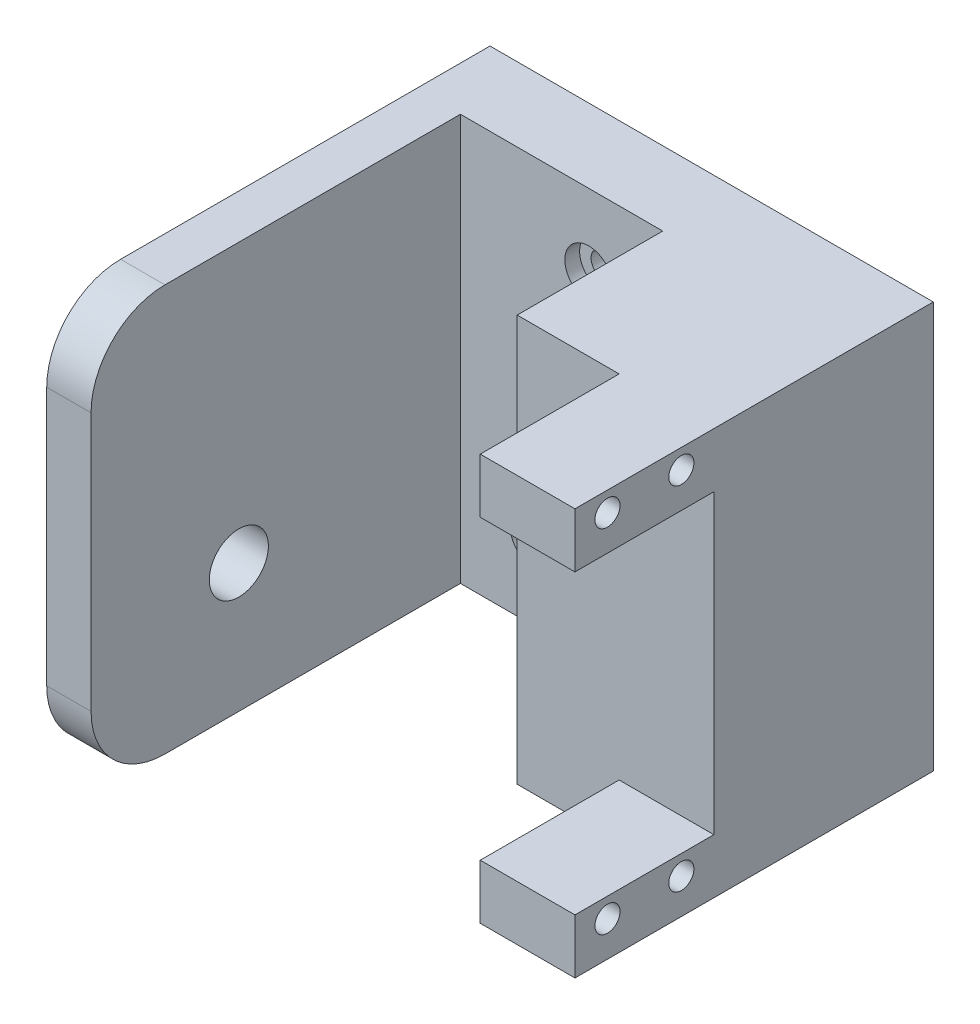
ISO-10303-21;
HEADER;
FILE_DESCRIPTION(('STEP AP214'),'2;1');
FILE_NAME('part.step','',(''),(''),'','','');
FILE_SCHEMA(('AUTOMOTIVE_DESIGN { 1 0 10303 214 1 1 1 1 }'));
ENDSEC;
DATA;
#1=APPLICATION_CONTEXT('core data for automotive mechanical design processes');
#2=APPLICATION_PROTOCOL_DEFINITION('international standard','automotive_design',2000,#1);
#3=PRODUCT_CONTEXT('',#1,'mechanical');
#4=PRODUCT('Part','Part','',(#3));
#5=PRODUCT_RELATED_PRODUCT_CATEGORY('part','',(#4));
#6=PRODUCT_DEFINITION_FORMATION('','',#4);
#7=PRODUCT_DEFINITION_CONTEXT('part definition',#1,'design');
#8=PRODUCT_DEFINITION('design','',#6,#7);
#9=PRODUCT_DEFINITION_SHAPE('','',#8);
#10=(LENGTH_UNIT() NAMED_UNIT(*) SI_UNIT(.MILLI.,.METRE.));
#11=(NAMED_UNIT(*) PLANE_ANGLE_UNIT() SI_UNIT($,.RADIAN.));
#12=(NAMED_UNIT(*) SI_UNIT($,.STERADIAN.) SOLID_ANGLE_UNIT());
#13=UNCERTAINTY_MEASURE_WITH_UNIT(LENGTH_MEASURE(1.E-05),#10,'distance_accuracy_value','');
#14=(GEOMETRIC_REPRESENTATION_CONTEXT(3) GLOBAL_UNCERTAINTY_ASSIGNED_CONTEXT((#13)) GLOBAL_UNIT_ASSIGNED_CONTEXT((#10,
#11,#12)) REPRESENTATION_CONTEXT('',''));
#15=CARTESIAN_POINT('',(0.,0.,0.));
#16=DIRECTION('',(0.,0.,1.));
#17=DIRECTION('',(1.,0.,0.));
#18=AXIS2_PLACEMENT_3D('',#15,#16,#17);
#19=CARTESIAN_POINT('',(60.,0.,10.));
#20=DIRECTION('',(-1.,0.,0.));
#21=DIRECTION('',(0.,0.,1.));
#22=AXIS2_PLACEMENT_3D('',#19,#20,#21);
#23=PLANE('',#22);
#24=CARTESIAN_POINT('',(60.,52.35,34.1));
#25=DIRECTION('',(-1.,0.,0.));
#26=DIRECTION('',(0.,0.,1.));
#27=AXIS2_PLACEMENT_3D('',#24,#25,#26);
#28=CIRCLE('',#27,1.69999999999999);
#29=CARTESIAN_POINT('',(60.,52.35,35.8));
#30=VERTEX_POINT('',#29);
#31=EDGE_CURVE('E356',#30,#30,#28,.F.);
#32=ORIENTED_EDGE('',*,*,#31,.F.);
#33=EDGE_LOOP('',(#32));
#34=FACE_BOUND('',#33,.T.);
#35=CARTESIAN_POINT('',(60.,4.75,34.1));
#36=DIRECTION('',(-1.,0.,0.));
#37=DIRECTION('',(0.,0.,1.));
#38=AXIS2_PLACEMENT_3D('',#35,#36,#37);
#39=CIRCLE('',#38,1.69999999999999);
#40=CARTESIAN_POINT('',(60.,4.75,35.8));
#41=VERTEX_POINT('',#40);
#42=EDGE_CURVE('E341',#41,#41,#39,.F.);
#43=ORIENTED_EDGE('',*,*,#42,.F.);
#44=EDGE_LOOP('',(#43));
#45=FACE_BOUND('',#44,.T.);
#46=DIRECTION('',(0.,1.,0.));
#47=VECTOR('',#46,1.);
#48=CARTESIAN_POINT('',(60.,0.,0.));
#49=LINE('',#48,#47);
#50=CARTESIAN_POINT('',(60.,0.,0.));
#51=VERTEX_POINT('',#50);
#52=CARTESIAN_POINT('',(60.,55.,0.));
#53=VERTEX_POINT('',#52);
#54=EDGE_CURVE('E272',#51,#53,#49,.T.);
#55=ORIENTED_EDGE('',*,*,#54,.T.);
#56=DIRECTION('',(0.,0.,-1.));
#57=VECTOR('',#56,1.);
#58=CARTESIAN_POINT('',(60.,55.,10.));
#59=LINE('',#58,#57);
#60=CARTESIAN_POINT('',(60.,55.,48.5));
#61=VERTEX_POINT('',#60);
#62=EDGE_CURVE('E277',#61,#53,#59,.T.);
#63=ORIENTED_EDGE('',*,*,#62,.F.);
#64=DIRECTION('',(0.,1.,0.));
#65=VECTOR('',#64,1.);
#66=CARTESIAN_POINT('',(60.,55.,48.5));
#67=LINE('',#66,#65);
#68=CARTESIAN_POINT('',(60.,47.6,48.5));
#69=VERTEX_POINT('',#68);
#70=EDGE_CURVE('E159',#69,#61,#67,.T.);
#71=ORIENTED_EDGE('',*,*,#70,.F.);
#72=DIRECTION('',(0.,0.,-1.));
#73=VECTOR('',#72,1.);
#74=CARTESIAN_POINT('',(60.,47.6,48.5));
#75=LINE('',#74,#73);
#76=CARTESIAN_POINT('',(60.,47.6,29.7));
#77=VERTEX_POINT('',#76);
#78=EDGE_CURVE('E155',#69,#77,#75,.T.);
#79=ORIENTED_EDGE('',*,*,#78,.T.);
#80=DIRECTION('',(0.,1.,0.));
#81=VECTOR('',#80,1.);
#82=CARTESIAN_POINT('',(60.,55.,29.7));
#83=LINE('',#82,#81);
#84=CARTESIAN_POINT('',(60.,7.4,29.7));
#85=VERTEX_POINT('',#84);
#86=EDGE_CURVE('E57',#85,#77,#83,.T.);
#87=ORIENTED_EDGE('',*,*,#86,.F.);
#88=DIRECTION('',(0.,0.,-1.));
#89=VECTOR('',#88,1.);
#90=CARTESIAN_POINT('',(60.,7.4,48.5));
#91=LINE('',#90,#89);
#92=CARTESIAN_POINT('',(60.,7.4,48.5));
#93=VERTEX_POINT('',#92);
#94=EDGE_CURVE('E195',#93,#85,#91,.T.);
#95=ORIENTED_EDGE('',*,*,#94,.F.);
#96=DIRECTION('',(0.,1.,0.));
#97=VECTOR('',#96,1.);
#98=CARTESIAN_POINT('',(60.,7.4,48.5));
#99=LINE('',#98,#97);
#100=CARTESIAN_POINT('',(60.,0.,48.5));
#101=VERTEX_POINT('',#100);
#102=EDGE_CURVE('E187',#101,#93,#99,.T.);
#103=ORIENTED_EDGE('',*,*,#102,.F.);
#104=DIRECTION('',(0.,0.,-1.));
#105=VECTOR('',#104,1.);
#106=CARTESIAN_POINT('',(60.,0.,10.));
#107=LINE('',#106,#105);
#108=EDGE_CURVE('E280',#101,#51,#107,.T.);
#109=ORIENTED_EDGE('',*,*,#108,.T.);
#110=EDGE_LOOP('',(#55,#63,#71,#79,#87,#95,#103,#109));
#111=FACE_BOUND('',#110,.T.);
#112=CARTESIAN_POINT('',(60.,4.75,44.1));
#113=DIRECTION('',(-1.,0.,0.));
#114=DIRECTION('',(0.,0.,1.));
#115=AXIS2_PLACEMENT_3D('',#112,#113,#114);
#116=CIRCLE('',#115,1.69999999999999);
#117=CARTESIAN_POINT('',(60.,4.75,45.8));
#118=VERTEX_POINT('',#117);
#119=EDGE_CURVE('E350',#118,#118,#116,.F.);
#120=ORIENTED_EDGE('',*,*,#119,.F.);
#121=EDGE_LOOP('',(#120));
#122=FACE_BOUND('',#121,.T.);
#123=CARTESIAN_POINT('',(60.,52.35,44.1));
#124=DIRECTION('',(-1.,0.,0.));
#125=DIRECTION('',(0.,0.,1.));
#126=AXIS2_PLACEMENT_3D('',#123,#124,#125);
#127=CIRCLE('',#126,1.69999999999999);
#128=CARTESIAN_POINT('',(60.,52.35,45.8));
#129=VERTEX_POINT('',#128);
#130=EDGE_CURVE('E362',#129,#129,#127,.F.);
#131=ORIENTED_EDGE('',*,*,#130,.F.);
#132=EDGE_LOOP('',(#131));
#133=FACE_BOUND('',#132,.T.);
#134=ADVANCED_FACE('F37',(#34,#45,#111,#122,#133),#23,.F.);
#135=CARTESIAN_POINT('',(0.,0.,29.7));
#136=DIRECTION('',(0.,0.,1.));
#137=DIRECTION('',(1.,0.,0.));
#138=AXIS2_PLACEMENT_3D('',#135,#136,#137);
#139=PLANE('',#138);
#140=DIRECTION('',(1.,0.,0.));
#141=VECTOR('',#140,1.);
#142=CARTESIAN_POINT('',(47.18,47.6,29.7));
#143=LINE('',#142,#141);
#144=CARTESIAN_POINT('',(47.18,47.6,29.7));
#145=VERTEX_POINT('',#144);
#146=EDGE_CURVE('E52',#145,#77,#143,.T.);
#147=ORIENTED_EDGE('',*,*,#146,.F.);
#148=DIRECTION('',(0.,-1.,0.));
#149=VECTOR('',#148,1.);
#150=CARTESIAN_POINT('',(47.18,55.,29.7));
#151=LINE('',#150,#149);
#152=CARTESIAN_POINT('',(47.18,55.,29.7));
#153=VERTEX_POINT('',#152);
#154=EDGE_CURVE('E171',#153,#145,#151,.T.);
#155=ORIENTED_EDGE('',*,*,#154,.F.);
#156=DIRECTION('',(-1.,0.,0.));
#157=VECTOR('',#156,1.);
#158=CARTESIAN_POINT('',(33.38,55.,29.7));
#159=LINE('',#158,#157);
#160=CARTESIAN_POINT('',(33.38,55.,29.7));
#161=VERTEX_POINT('',#160);
#162=EDGE_CURVE('E237',#153,#161,#159,.T.);
#163=ORIENTED_EDGE('',*,*,#162,.T.);
#164=DIRECTION('',(0.,-1.,0.));
#165=VECTOR('',#164,1.);
#166=CARTESIAN_POINT('',(33.38,55.,29.7));
#167=LINE('',#166,#165);
#168=CARTESIAN_POINT('',(33.38,0.,29.7));
#169=VERTEX_POINT('',#168);
#170=EDGE_CURVE('E230',#161,#169,#167,.T.);
#171=ORIENTED_EDGE('',*,*,#170,.T.);
#172=DIRECTION('',(1.,0.,0.));
#173=VECTOR('',#172,1.);
#174=CARTESIAN_POINT('',(33.38,0.,29.7));
#175=LINE('',#174,#173);
#176=CARTESIAN_POINT('',(47.18,0.,29.7));
#177=VERTEX_POINT('',#176);
#178=EDGE_CURVE('E233',#169,#177,#175,.T.);
#179=ORIENTED_EDGE('',*,*,#178,.T.);
#180=DIRECTION('',(0.,-1.,0.));
#181=VECTOR('',#180,1.);
#182=CARTESIAN_POINT('',(47.18,7.4,29.7));
#183=LINE('',#182,#181);
#184=CARTESIAN_POINT('',(47.18,7.4,29.7));
#185=VERTEX_POINT('',#184);
#186=EDGE_CURVE('E172',#185,#177,#183,.T.);
#187=ORIENTED_EDGE('',*,*,#186,.F.);
#188=DIRECTION('',(-1.,0.,0.));
#189=VECTOR('',#188,1.);
#190=CARTESIAN_POINT('',(47.18,7.4,29.7));
#191=LINE('',#190,#189);
#192=EDGE_CURVE('E175',#85,#185,#191,.T.);
#193=ORIENTED_EDGE('',*,*,#192,.F.);
#194=ORIENTED_EDGE('',*,*,#86,.T.);
#195=EDGE_LOOP('',(#147,#155,#163,#171,#179,#187,#193,#194));
#196=FACE_BOUND('',#195,.T.);
#197=ADVANCED_FACE('F339',(#196),#139,.T.);
#198=CARTESIAN_POINT('',(0.,0.,10.));
#199=DIRECTION('',(0.,0.,-1.));
#200=DIRECTION('',(-1.,0.,0.));
#201=AXIS2_PLACEMENT_3D('',#198,#199,#200);
#202=PLANE('',#201);
#203=CARTESIAN_POINT('',(23.38,45.,10.));
#204=DIRECTION('',(0.,0.,1.));
#205=DIRECTION('',(1.,0.,0.));
#206=AXIS2_PLACEMENT_3D('',#203,#204,#205);
#207=CIRCLE('',#206,3.25);
#208=CARTESIAN_POINT('',(26.63,45.,10.));
#209=VERTEX_POINT('',#208);
#210=EDGE_CURVE('E205',#209,#209,#207,.T.);
#211=ORIENTED_EDGE('',*,*,#210,.F.);
#212=EDGE_LOOP('',(#211));
#213=FACE_BOUND('',#212,.T.);
#214=CARTESIAN_POINT('',(16.,10.,10.));
#215=DIRECTION('',(0.,0.,1.));
#216=DIRECTION('',(1.,0.,0.));
#217=AXIS2_PLACEMENT_3D('',#214,#215,#216);
#218=CIRCLE('',#217,3.25);
#219=CARTESIAN_POINT('',(19.25,10.,10.));
#220=VERTEX_POINT('',#219);
#221=EDGE_CURVE('E213',#220,#220,#218,.T.);
#222=ORIENTED_EDGE('',*,*,#221,.F.);
#223=EDGE_LOOP('',(#222));
#224=FACE_BOUND('',#223,.T.);
#225=DIRECTION('',(0.,-1.,0.));
#226=VECTOR('',#225,1.);
#227=CARTESIAN_POINT('',(33.38,55.,10.));
#228=LINE('',#227,#226);
#229=CARTESIAN_POINT('',(33.38,55.,10.));
#230=VERTEX_POINT('',#229);
#231=CARTESIAN_POINT('',(33.38,0.,10.));
#232=VERTEX_POINT('',#231);
#233=EDGE_CURVE('E225',#230,#232,#228,.T.);
#234=ORIENTED_EDGE('',*,*,#233,.F.);
#235=DIRECTION('',(-1.,0.,0.));
#236=VECTOR('',#235,1.);
#237=CARTESIAN_POINT('',(0.,55.,10.));
#238=LINE('',#237,#236);
#239=CARTESIAN_POINT('',(6.,55.,10.));
#240=VERTEX_POINT('',#239);
#241=EDGE_CURVE('E263',#230,#240,#238,.T.);
#242=ORIENTED_EDGE('',*,*,#241,.T.);
#243=DIRECTION('',(0.,1.,0.));
#244=VECTOR('',#243,1.);
#245=CARTESIAN_POINT('',(6.,55.,10.));
#246=LINE('',#245,#244);
#247=CARTESIAN_POINT('',(6.,0.,10.));
#248=VERTEX_POINT('',#247);
#249=EDGE_CURVE('E247',#248,#240,#246,.T.);
#250=ORIENTED_EDGE('',*,*,#249,.F.);
#251=DIRECTION('',(1.,0.,0.));
#252=VECTOR('',#251,1.);
#253=CARTESIAN_POINT('',(0.,0.,10.));
#254=LINE('',#253,#252);
#255=EDGE_CURVE('E261',#248,#232,#254,.T.);
#256=ORIENTED_EDGE('',*,*,#255,.T.);
#257=EDGE_LOOP('',(#234,#242,#250,#256));
#258=FACE_BOUND('',#257,.T.);
#259=ADVANCED_FACE('F334',(#213,#224,#258),#202,.F.);
#260=CARTESIAN_POINT('',(0.,0.,10.));
#261=DIRECTION('',(1.,0.,0.));
#262=DIRECTION('',(0.,0.,-1.));
#263=AXIS2_PLACEMENT_3D('',#260,#261,#262);
#264=PLANE('',#263);
#265=CARTESIAN_POINT('',(0.,17.4,40.));
#266=DIRECTION('',(-1.,0.,0.));
#267=DIRECTION('',(0.,0.,1.));
#268=AXIS2_PLACEMENT_3D('',#265,#266,#267);
#269=CIRCLE('',#268,4.00000000000001);
#270=CARTESIAN_POINT('',(0.,17.4,44.));
#271=VERTEX_POINT('',#270);
#272=EDGE_CURVE('E199',#271,#271,#269,.T.);
#273=ORIENTED_EDGE('',*,*,#272,.F.);
#274=EDGE_LOOP('',(#273));
#275=FACE_BOUND('',#274,.T.);
#276=DIRECTION('',(0.,-1.,0.));
#277=VECTOR('',#276,1.);
#278=CARTESIAN_POINT('',(0.,55.,60.));
#279=LINE('',#278,#277);
#280=CARTESIAN_POINT('',(0.,45.,60.));
#281=VERTEX_POINT('',#280);
#282=CARTESIAN_POINT('',(0.,10.,60.));
#283=VERTEX_POINT('',#282);
#284=EDGE_CURVE('E248',#281,#283,#279,.T.);
#285=ORIENTED_EDGE('',*,*,#284,.F.);
#286=CARTESIAN_POINT('',(0.,45.,50.));
#287=DIRECTION('',(1.,0.,0.));
#288=DIRECTION('',(0.,0.,-1.));
#289=AXIS2_PLACEMENT_3D('',#286,#287,#288);
#290=CIRCLE('',#289,10.);
#291=CARTESIAN_POINT('',(0.,55.,50.));
#292=VERTEX_POINT('',#291);
#293=EDGE_CURVE('E293',#281,#292,#290,.F.);
#294=ORIENTED_EDGE('',*,*,#293,.T.);
#295=DIRECTION('',(0.,0.,-1.));
#296=VECTOR('',#295,1.);
#297=CARTESIAN_POINT('',(0.,55.,10.));
#298=LINE('',#297,#296);
#299=CARTESIAN_POINT('',(0.,55.,0.));
#300=VERTEX_POINT('',#299);
#301=EDGE_CURVE('E267',#292,#300,#298,.T.);
#302=ORIENTED_EDGE('',*,*,#301,.T.);
#303=DIRECTION('',(0.,-1.,0.));
#304=VECTOR('',#303,1.);
#305=CARTESIAN_POINT('',(0.,0.,0.));
#306=LINE('',#305,#304);
#307=CARTESIAN_POINT('',(0.,0.,0.));
#308=VERTEX_POINT('',#307);
#309=EDGE_CURVE('E260',#300,#308,#306,.T.);
#310=ORIENTED_EDGE('',*,*,#309,.T.);
#311=DIRECTION('',(0.,0.,-1.));
#312=VECTOR('',#311,1.);
#313=CARTESIAN_POINT('',(0.,0.,10.));
#314=LINE('',#313,#312);
#315=CARTESIAN_POINT('',(0.,0.,50.));
#316=VERTEX_POINT('',#315);
#317=EDGE_CURVE('E283',#316,#308,#314,.T.);
#318=ORIENTED_EDGE('',*,*,#317,.F.);
#319=CARTESIAN_POINT('',(0.,10.,50.));
#320=DIRECTION('',(1.,0.,0.));
#321=DIRECTION('',(0.,0.,-1.));
#322=AXIS2_PLACEMENT_3D('',#319,#320,#321);
#323=CIRCLE('',#322,10.);
#324=EDGE_CURVE('E291',#316,#283,#323,.F.);
#325=ORIENTED_EDGE('',*,*,#324,.T.);
#326=EDGE_LOOP('',(#285,#294,#302,#310,#318,#325));
#327=FACE_BOUND('',#326,.T.);
#328=ADVANCED_FACE('F313',(#275,#327),#264,.F.);
#329=CARTESIAN_POINT('',(0.,0.,10.));
#330=DIRECTION('',(0.,1.,0.));
#331=DIRECTION('',(0.,0.,1.));
#332=AXIS2_PLACEMENT_3D('',#329,#330,#331);
#333=PLANE('',#332);
#334=DIRECTION('',(0.,0.,-1.));
#335=VECTOR('',#334,1.);
#336=CARTESIAN_POINT('',(6.,0.,60.));
#337=LINE('',#336,#335);
#338=CARTESIAN_POINT('',(6.,0.,50.));
#339=VERTEX_POINT('',#338);
#340=EDGE_CURVE('E258',#339,#248,#337,.T.);
#341=ORIENTED_EDGE('',*,*,#340,.F.);
#342=DIRECTION('',(1.,0.,0.));
#343=VECTOR('',#342,1.);
#344=CARTESIAN_POINT('',(0.,0.,50.));
#345=LINE('',#344,#343);
#346=EDGE_CURVE('E11',#339,#316,#345,.F.);
#347=ORIENTED_EDGE('',*,*,#346,.T.);
#348=ORIENTED_EDGE('',*,*,#317,.T.);
#349=DIRECTION('',(1.,0.,0.));
#350=VECTOR('',#349,1.);
#351=CARTESIAN_POINT('',(0.,0.,0.));
#352=LINE('',#351,#350);
#353=EDGE_CURVE('E270',#308,#51,#352,.T.);
#354=ORIENTED_EDGE('',*,*,#353,.T.);
#355=ORIENTED_EDGE('',*,*,#108,.F.);
#356=DIRECTION('',(1.,0.,0.));
#357=VECTOR('',#356,1.);
#358=CARTESIAN_POINT('',(47.18,0.,48.5));
#359=LINE('',#358,#357);
#360=CARTESIAN_POINT('',(47.18,0.,48.5));
#361=VERTEX_POINT('',#360);
#362=EDGE_CURVE('E184',#361,#101,#359,.T.);
#363=ORIENTED_EDGE('',*,*,#362,.F.);
#364=DIRECTION('',(0.,0.,-1.));
#365=VECTOR('',#364,1.);
#366=CARTESIAN_POINT('',(47.18,0.,48.5));
#367=LINE('',#366,#365);
#368=EDGE_CURVE('E197',#361,#177,#367,.T.);
#369=ORIENTED_EDGE('',*,*,#368,.T.);
#370=ORIENTED_EDGE('',*,*,#178,.F.);
#371=DIRECTION('',(0.,0.,-1.));
#372=VECTOR('',#371,1.);
#373=CARTESIAN_POINT('',(33.38,0.,29.7));
#374=LINE('',#373,#372);
#375=EDGE_CURVE('E244',#169,#232,#374,.T.);
#376=ORIENTED_EDGE('',*,*,#375,.T.);
#377=ORIENTED_EDGE('',*,*,#255,.F.);
#378=EDGE_LOOP('',(#341,#347,#348,#354,#355,#363,#369,#370,#376,#377));
#379=FACE_BOUND('',#378,.T.);
#380=ADVANCED_FACE('F330',(#379),#333,.F.);
#381=CARTESIAN_POINT('',(0.,55.,10.));
#382=DIRECTION('',(0.,-1.,0.));
#383=DIRECTION('',(0.,0.,-1.));
#384=AXIS2_PLACEMENT_3D('',#381,#382,#383);
#385=PLANE('',#384);
#386=ORIENTED_EDGE('',*,*,#301,.F.);
#387=DIRECTION('',(-1.,0.,0.));
#388=VECTOR('',#387,1.);
#389=CARTESIAN_POINT('',(6.,55.,50.));
#390=LINE('',#389,#388);
#391=CARTESIAN_POINT('',(6.,55.,50.));
#392=VERTEX_POINT('',#391);
#393=EDGE_CURVE('E295',#292,#392,#390,.F.);
#394=ORIENTED_EDGE('',*,*,#393,.T.);
#395=DIRECTION('',(0.,0.,-1.));
#396=VECTOR('',#395,1.);
#397=CARTESIAN_POINT('',(6.,55.,60.));
#398=LINE('',#397,#396);
#399=EDGE_CURVE('E254',#392,#240,#398,.T.);
#400=ORIENTED_EDGE('',*,*,#399,.T.);
#401=ORIENTED_EDGE('',*,*,#241,.F.);
#402=DIRECTION('',(0.,0.,-1.));
#403=VECTOR('',#402,1.);
#404=CARTESIAN_POINT('',(33.38,55.,29.7));
#405=LINE('',#404,#403);
#406=EDGE_CURVE('E239',#161,#230,#405,.T.);
#407=ORIENTED_EDGE('',*,*,#406,.F.);
#408=ORIENTED_EDGE('',*,*,#162,.F.);
#409=DIRECTION('',(0.,0.,-1.));
#410=VECTOR('',#409,1.);
#411=CARTESIAN_POINT('',(47.18,55.,48.5));
#412=LINE('',#411,#410);
#413=CARTESIAN_POINT('',(47.18,55.,48.5));
#414=VERTEX_POINT('',#413);
#415=EDGE_CURVE('E177',#414,#153,#412,.T.);
#416=ORIENTED_EDGE('',*,*,#415,.F.);
#417=DIRECTION('',(-1.,0.,0.));
#418=VECTOR('',#417,1.);
#419=CARTESIAN_POINT('',(47.18,55.,48.5));
#420=LINE('',#419,#418);
#421=EDGE_CURVE('E165',#61,#414,#420,.T.);
#422=ORIENTED_EDGE('',*,*,#421,.F.);
#423=ORIENTED_EDGE('',*,*,#62,.T.);
#424=DIRECTION('',(-1.,0.,0.));
#425=VECTOR('',#424,1.);
#426=CARTESIAN_POINT('',(0.,55.,0.));
#427=LINE('',#426,#425);
#428=EDGE_CURVE('E264',#53,#300,#427,.T.);
#429=ORIENTED_EDGE('',*,*,#428,.T.);
#430=EDGE_LOOP('',(#386,#394,#400,#401,#407,#408,#416,#422,#423,#429));
#431=FACE_BOUND('',#430,.T.);
#432=ADVANCED_FACE('F315',(#431),#385,.F.);
#433=CARTESIAN_POINT('',(0.,0.,0.));
#434=DIRECTION('',(0.,0.,-1.));
#435=DIRECTION('',(-1.,0.,0.));
#436=AXIS2_PLACEMENT_3D('',#433,#434,#435);
#437=PLANE('',#436);
#438=CARTESIAN_POINT('',(23.38,45.,0.));
#439=DIRECTION('',(0.,0.,-1.));
#440=DIRECTION('',(-1.,0.,0.));
#441=AXIS2_PLACEMENT_3D('',#438,#439,#440);
#442=CIRCLE('',#441,1.7);
#443=CARTESIAN_POINT('',(21.68,45.,0.));
#444=VERTEX_POINT('',#443);
#445=EDGE_CURVE('E210',#444,#444,#442,.F.);
#446=ORIENTED_EDGE('',*,*,#445,.T.);
#447=EDGE_LOOP('',(#446));
#448=FACE_BOUND('',#447,.T.);
#449=CARTESIAN_POINT('',(16.,10.,0.));
#450=DIRECTION('',(0.,0.,-1.));
#451=DIRECTION('',(-1.,0.,0.));
#452=AXIS2_PLACEMENT_3D('',#449,#450,#451);
#453=CIRCLE('',#452,1.7);
#454=CARTESIAN_POINT('',(14.3,10.,0.));
#455=VERTEX_POINT('',#454);
#456=EDGE_CURVE('E222',#455,#455,#453,.F.);
#457=ORIENTED_EDGE('',*,*,#456,.T.);
#458=EDGE_LOOP('',(#457));
#459=FACE_BOUND('',#458,.T.);
#460=ORIENTED_EDGE('',*,*,#309,.F.);
#461=ORIENTED_EDGE('',*,*,#428,.F.);
#462=ORIENTED_EDGE('',*,*,#54,.F.);
#463=ORIENTED_EDGE('',*,*,#353,.F.);
#464=EDGE_LOOP('',(#460,#461,#462,#463));
#465=FACE_BOUND('',#464,.T.);
#466=ADVANCED_FACE('F321',(#448,#459,#465),#437,.T.);
#467=CARTESIAN_POINT('',(6.,55.,60.));
#468=DIRECTION('',(-1.,0.,0.));
#469=DIRECTION('',(0.,-1.,0.));
#470=AXIS2_PLACEMENT_3D('',#467,#468,#469);
#471=PLANE('',#470);
#472=CARTESIAN_POINT('',(6.,17.4,40.));
#473=DIRECTION('',(-1.,0.,0.));
#474=DIRECTION('',(0.,-1.,0.));
#475=AXIS2_PLACEMENT_3D('',#472,#473,#474);
#476=CIRCLE('',#475,4.00000000000001);
#477=CARTESIAN_POINT('',(6.,13.4,40.));
#478=VERTEX_POINT('',#477);
#479=EDGE_CURVE('E202',#478,#478,#476,.F.);
#480=ORIENTED_EDGE('',*,*,#479,.F.);
#481=EDGE_LOOP('',(#480));
#482=FACE_BOUND('',#481,.T.);
#483=ORIENTED_EDGE('',*,*,#399,.F.);
#484=CARTESIAN_POINT('',(6.,45.,50.));
#485=DIRECTION('',(-1.,0.,0.));
#486=DIRECTION('',(0.,-1.,0.));
#487=AXIS2_PLACEMENT_3D('',#484,#485,#486);
#488=CIRCLE('',#487,10.);
#489=CARTESIAN_POINT('',(6.,45.,60.));
#490=VERTEX_POINT('',#489);
#491=EDGE_CURVE('E45',#392,#490,#488,.F.);
#492=ORIENTED_EDGE('',*,*,#491,.T.);
#493=DIRECTION('',(0.,1.,0.));
#494=VECTOR('',#493,1.);
#495=CARTESIAN_POINT('',(6.,55.,60.));
#496=LINE('',#495,#494);
#497=CARTESIAN_POINT('',(6.,10.,60.));
#498=VERTEX_POINT('',#497);
#499=EDGE_CURVE('E251',#498,#490,#496,.T.);
#500=ORIENTED_EDGE('',*,*,#499,.F.);
#501=CARTESIAN_POINT('',(6.,10.,50.));
#502=DIRECTION('',(-1.,0.,0.));
#503=DIRECTION('',(0.,-1.,0.));
#504=AXIS2_PLACEMENT_3D('',#501,#502,#503);
#505=CIRCLE('',#504,10.);
#506=EDGE_CURVE('E297',#498,#339,#505,.F.);
#507=ORIENTED_EDGE('',*,*,#506,.T.);
#508=ORIENTED_EDGE('',*,*,#340,.T.);
#509=ORIENTED_EDGE('',*,*,#249,.T.);
#510=EDGE_LOOP('',(#483,#492,#500,#507,#508,#509));
#511=FACE_BOUND('',#510,.T.);
#512=ADVANCED_FACE('F302',(#482,#511),#471,.F.);
#513=CARTESIAN_POINT('',(0.,0.,60.));
#514=DIRECTION('',(0.,0.,1.));
#515=DIRECTION('',(1.,0.,0.));
#516=AXIS2_PLACEMENT_3D('',#513,#514,#515);
#517=PLANE('',#516);
#518=ORIENTED_EDGE('',*,*,#499,.T.);
#519=DIRECTION('',(-1.,0.,0.));
#520=VECTOR('',#519,1.);
#521=CARTESIAN_POINT('',(0.,45.,60.));
#522=LINE('',#521,#520);
#523=EDGE_CURVE('E288',#490,#281,#522,.T.);
#524=ORIENTED_EDGE('',*,*,#523,.T.);
#525=ORIENTED_EDGE('',*,*,#284,.T.);
#526=DIRECTION('',(1.,0.,0.));
#527=VECTOR('',#526,1.);
#528=CARTESIAN_POINT('',(6.,10.,60.));
#529=LINE('',#528,#527);
#530=EDGE_CURVE('E285',#283,#498,#529,.T.);
#531=ORIENTED_EDGE('',*,*,#530,.T.);
#532=EDGE_LOOP('',(#518,#524,#525,#531));
#533=FACE_BOUND('',#532,.T.);
#534=ADVANCED_FACE('F307',(#533),#517,.T.);
#535=CARTESIAN_POINT('',(33.38,55.,29.7));
#536=DIRECTION('',(1.,0.,0.));
#537=DIRECTION('',(0.,0.,-1.));
#538=AXIS2_PLACEMENT_3D('',#535,#536,#537);
#539=PLANE('',#538);
#540=ORIENTED_EDGE('',*,*,#233,.T.);
#541=ORIENTED_EDGE('',*,*,#375,.F.);
#542=ORIENTED_EDGE('',*,*,#170,.F.);
#543=ORIENTED_EDGE('',*,*,#406,.T.);
#544=EDGE_LOOP('',(#540,#541,#542,#543));
#545=FACE_BOUND('',#544,.T.);
#546=ADVANCED_FACE('F338',(#545),#539,.F.);
#547=CARTESIAN_POINT('',(16.,10.,10.));
#548=DIRECTION('',(0.,0.,1.));
#549=DIRECTION('',(1.,0.,0.));
#550=AXIS2_PLACEMENT_3D('',#547,#548,#549);
#551=CYLINDRICAL_SURFACE('',#550,1.7);
#552=ORIENTED_EDGE('',*,*,#456,.F.);
#553=EDGE_LOOP('',(#552));
#554=FACE_BOUND('',#553,.T.);
#555=CARTESIAN_POINT('',(16.,10.,8.));
#556=DIRECTION('',(0.,0.,1.));
#557=DIRECTION('',(1.,0.,0.));
#558=AXIS2_PLACEMENT_3D('',#555,#556,#557);
#559=CIRCLE('',#558,1.7);
#560=CARTESIAN_POINT('',(17.7,10.,8.));
#561=VERTEX_POINT('',#560);
#562=EDGE_CURVE('E218',#561,#561,#559,.T.);
#563=ORIENTED_EDGE('',*,*,#562,.T.);
#564=EDGE_LOOP('',(#563));
#565=FACE_BOUND('',#564,.T.);
#566=ADVANCED_FACE('F410',(#554,#565),#551,.F.);
#567=CARTESIAN_POINT('',(17.7,10.,8.));
#568=DIRECTION('',(0.,0.,-1.));
#569=DIRECTION('',(-1.,0.,0.));
#570=AXIS2_PLACEMENT_3D('',#567,#568,#569);
#571=PLANE('',#570);
#572=ORIENTED_EDGE('',*,*,#562,.F.);
#573=EDGE_LOOP('',(#572));
#574=FACE_BOUND('',#573,.T.);
#575=CARTESIAN_POINT('',(16.,10.,8.));
#576=DIRECTION('',(0.,0.,1.));
#577=DIRECTION('',(1.,0.,0.));
#578=AXIS2_PLACEMENT_3D('',#575,#576,#577);
#579=CIRCLE('',#578,3.25);
#580=CARTESIAN_POINT('',(19.25,10.,8.));
#581=VERTEX_POINT('',#580);
#582=EDGE_CURVE('E221',#581,#581,#579,.T.);
#583=ORIENTED_EDGE('',*,*,#582,.T.);
#584=EDGE_LOOP('',(#583));
#585=FACE_BOUND('',#584,.T.);
#586=ADVANCED_FACE('F413',(#574,#585),#571,.F.);
#587=CARTESIAN_POINT('',(16.,10.,10.));
#588=DIRECTION('',(0.,0.,1.));
#589=DIRECTION('',(1.,0.,0.));
#590=AXIS2_PLACEMENT_3D('',#587,#588,#589);
#591=CYLINDRICAL_SURFACE('',#590,3.25);
#592=ORIENTED_EDGE('',*,*,#582,.F.);
#593=EDGE_LOOP('',(#592));
#594=FACE_BOUND('',#593,.T.);
#595=ORIENTED_EDGE('',*,*,#221,.T.);
#596=EDGE_LOOP('',(#595));
#597=FACE_BOUND('',#596,.T.);
#598=ADVANCED_FACE('F417',(#594,#597),#591,.F.);
#599=CARTESIAN_POINT('',(23.38,45.,10.));
#600=DIRECTION('',(0.,0.,1.));
#601=DIRECTION('',(1.,0.,0.));
#602=AXIS2_PLACEMENT_3D('',#599,#600,#601);
#603=CYLINDRICAL_SURFACE('',#602,1.7);
#604=ORIENTED_EDGE('',*,*,#445,.F.);
#605=EDGE_LOOP('',(#604));
#606=FACE_BOUND('',#605,.T.);
#607=CARTESIAN_POINT('',(23.38,45.,8.));
#608=DIRECTION('',(0.,0.,1.));
#609=DIRECTION('',(1.,0.,0.));
#610=AXIS2_PLACEMENT_3D('',#607,#608,#609);
#611=CIRCLE('',#610,1.7);
#612=CARTESIAN_POINT('',(25.08,45.,8.));
#613=VERTEX_POINT('',#612);
#614=EDGE_CURVE('E206',#613,#613,#611,.T.);
#615=ORIENTED_EDGE('',*,*,#614,.T.);
#616=EDGE_LOOP('',(#615));
#617=FACE_BOUND('',#616,.T.);
#618=ADVANCED_FACE('F403',(#606,#617),#603,.F.);
#619=CARTESIAN_POINT('',(25.08,45.,8.));
#620=DIRECTION('',(0.,0.,-1.));
#621=DIRECTION('',(-1.,0.,0.));
#622=AXIS2_PLACEMENT_3D('',#619,#620,#621);
#623=PLANE('',#622);
#624=ORIENTED_EDGE('',*,*,#614,.F.);
#625=EDGE_LOOP('',(#624));
#626=FACE_BOUND('',#625,.T.);
#627=CARTESIAN_POINT('',(23.38,45.,8.));
#628=DIRECTION('',(0.,0.,1.));
#629=DIRECTION('',(1.,0.,0.));
#630=AXIS2_PLACEMENT_3D('',#627,#628,#629);
#631=CIRCLE('',#630,3.25);
#632=CARTESIAN_POINT('',(26.63,45.,8.));
#633=VERTEX_POINT('',#632);
#634=EDGE_CURVE('E209',#633,#633,#631,.T.);
#635=ORIENTED_EDGE('',*,*,#634,.T.);
#636=EDGE_LOOP('',(#635));
#637=FACE_BOUND('',#636,.T.);
#638=ADVANCED_FACE('F397',(#626,#637),#623,.F.);
#639=CARTESIAN_POINT('',(23.38,45.,10.));
#640=DIRECTION('',(0.,0.,1.));
#641=DIRECTION('',(1.,0.,0.));
#642=AXIS2_PLACEMENT_3D('',#639,#640,#641);
#643=CYLINDRICAL_SURFACE('',#642,3.25);
#644=ORIENTED_EDGE('',*,*,#634,.F.);
#645=EDGE_LOOP('',(#644));
#646=FACE_BOUND('',#645,.T.);
#647=ORIENTED_EDGE('',*,*,#210,.T.);
#648=EDGE_LOOP('',(#647));
#649=FACE_BOUND('',#648,.T.);
#650=ADVANCED_FACE('F391',(#646,#649),#643,.F.);
#651=CARTESIAN_POINT('',(0.,45.,50.));
#652=DIRECTION('',(1.,0.,0.));
#653=DIRECTION('',(0.,0.,-1.));
#654=AXIS2_PLACEMENT_3D('',#651,#652,#653);
#655=CYLINDRICAL_SURFACE('',#654,10.);
#656=ORIENTED_EDGE('',*,*,#491,.F.);
#657=ORIENTED_EDGE('',*,*,#393,.F.);
#658=ORIENTED_EDGE('',*,*,#293,.F.);
#659=ORIENTED_EDGE('',*,*,#523,.F.);
#660=EDGE_LOOP('',(#656,#657,#658,#659));
#661=FACE_BOUND('',#660,.T.);
#662=ADVANCED_FACE('F310',(#661),#655,.T.);
#663=CARTESIAN_POINT('',(0.,10.,50.));
#664=DIRECTION('',(-1.,0.,0.));
#665=DIRECTION('',(0.,0.,1.));
#666=AXIS2_PLACEMENT_3D('',#663,#664,#665);
#667=CYLINDRICAL_SURFACE('',#666,10.);
#668=ORIENTED_EDGE('',*,*,#324,.F.);
#669=ORIENTED_EDGE('',*,*,#346,.F.);
#670=ORIENTED_EDGE('',*,*,#506,.F.);
#671=ORIENTED_EDGE('',*,*,#530,.F.);
#672=EDGE_LOOP('',(#668,#669,#670,#671));
#673=FACE_BOUND('',#672,.T.);
#674=ADVANCED_FACE('F39',(#673),#667,.T.);
#675=CARTESIAN_POINT('',(17.3137084989848,17.4,40.));
#676=DIRECTION('',(-1.,0.,0.));
#677=DIRECTION('',(0.,0.,1.));
#678=AXIS2_PLACEMENT_3D('',#675,#676,#677);
#679=CYLINDRICAL_SURFACE('',#678,4.00000000000001);
#680=ORIENTED_EDGE('',*,*,#479,.T.);
#681=EDGE_LOOP('',(#680));
#682=FACE_BOUND('',#681,.T.);
#683=ORIENTED_EDGE('',*,*,#272,.T.);
#684=EDGE_LOOP('',(#683));
#685=FACE_BOUND('',#684,.T.);
#686=ADVANCED_FACE('F396',(#682,#685),#679,.F.);
#687=CARTESIAN_POINT('',(47.18,7.4,48.5));
#688=DIRECTION('',(1.,0.,0.));
#689=DIRECTION('',(0.,0.,-1.));
#690=AXIS2_PLACEMENT_3D('',#687,#688,#689);
#691=PLANE('',#690);
#692=CARTESIAN_POINT('',(47.18,4.75,44.1));
#693=DIRECTION('',(-1.,0.,0.));
#694=DIRECTION('',(0.,0.,1.));
#695=AXIS2_PLACEMENT_3D('',#692,#693,#694);
#696=CIRCLE('',#695,1.69999999999999);
#697=CARTESIAN_POINT('',(47.18,4.75,45.8));
#698=VERTEX_POINT('',#697);
#699=EDGE_CURVE('E353',#698,#698,#696,.T.);
#700=ORIENTED_EDGE('',*,*,#699,.F.);
#701=EDGE_LOOP('',(#700));
#702=FACE_BOUND('',#701,.T.);
#703=CARTESIAN_POINT('',(47.18,4.75,34.1));
#704=DIRECTION('',(-1.,0.,0.));
#705=DIRECTION('',(0.,0.,1.));
#706=AXIS2_PLACEMENT_3D('',#703,#704,#705);
#707=CIRCLE('',#706,1.69999999999999);
#708=CARTESIAN_POINT('',(47.18,4.75,35.8));
#709=VERTEX_POINT('',#708);
#710=EDGE_CURVE('E347',#709,#709,#707,.T.);
#711=ORIENTED_EDGE('',*,*,#710,.F.);
#712=EDGE_LOOP('',(#711));
#713=FACE_BOUND('',#712,.T.);
#714=ORIENTED_EDGE('',*,*,#186,.T.);
#715=ORIENTED_EDGE('',*,*,#368,.F.);
#716=DIRECTION('',(0.,-1.,0.));
#717=VECTOR('',#716,1.);
#718=CARTESIAN_POINT('',(47.18,7.4,48.5));
#719=LINE('',#718,#717);
#720=CARTESIAN_POINT('',(47.18,7.4,48.5));
#721=VERTEX_POINT('',#720);
#722=EDGE_CURVE('E181',#721,#361,#719,.T.);
#723=ORIENTED_EDGE('',*,*,#722,.F.);
#724=DIRECTION('',(0.,0.,-1.));
#725=VECTOR('',#724,1.);
#726=CARTESIAN_POINT('',(47.18,7.4,48.5));
#727=LINE('',#726,#725);
#728=EDGE_CURVE('E190',#721,#185,#727,.T.);
#729=ORIENTED_EDGE('',*,*,#728,.T.);
#730=EDGE_LOOP('',(#714,#715,#723,#729));
#731=FACE_BOUND('',#730,.T.);
#732=ADVANCED_FACE('F456',(#702,#713,#731),#691,.F.);
#733=CARTESIAN_POINT('',(47.18,7.4,48.5));
#734=DIRECTION('',(0.,-1.,0.));
#735=DIRECTION('',(1.,0.,0.));
#736=AXIS2_PLACEMENT_3D('',#733,#734,#735);
#737=PLANE('',#736);
#738=ORIENTED_EDGE('',*,*,#192,.T.);
#739=ORIENTED_EDGE('',*,*,#728,.F.);
#740=DIRECTION('',(-1.,0.,0.));
#741=VECTOR('',#740,1.);
#742=CARTESIAN_POINT('',(47.18,7.4,48.5));
#743=LINE('',#742,#741);
#744=EDGE_CURVE('E189',#93,#721,#743,.T.);
#745=ORIENTED_EDGE('',*,*,#744,.F.);
#746=ORIENTED_EDGE('',*,*,#94,.T.);
#747=EDGE_LOOP('',(#738,#739,#745,#746));
#748=FACE_BOUND('',#747,.T.);
#749=ADVANCED_FACE('F460',(#748),#737,.F.);
#750=CARTESIAN_POINT('',(0.,0.,48.5));
#751=DIRECTION('',(0.,0.,1.));
#752=DIRECTION('',(1.,0.,0.));
#753=AXIS2_PLACEMENT_3D('',#750,#751,#752);
#754=PLANE('',#753);
#755=ORIENTED_EDGE('',*,*,#722,.T.);
#756=ORIENTED_EDGE('',*,*,#362,.T.);
#757=ORIENTED_EDGE('',*,*,#102,.T.);
#758=ORIENTED_EDGE('',*,*,#744,.T.);
#759=EDGE_LOOP('',(#755,#756,#757,#758));
#760=FACE_BOUND('',#759,.T.);
#761=ADVANCED_FACE('F464',(#760),#754,.T.);
#762=CARTESIAN_POINT('',(47.18,55.,48.5));
#763=DIRECTION('',(1.,0.,0.));
#764=DIRECTION('',(0.,0.,-1.));
#765=AXIS2_PLACEMENT_3D('',#762,#763,#764);
#766=PLANE('',#765);
#767=CARTESIAN_POINT('',(47.18,52.35,44.1));
#768=DIRECTION('',(-1.,0.,0.));
#769=DIRECTION('',(0.,0.,1.));
#770=AXIS2_PLACEMENT_3D('',#767,#768,#769);
#771=CIRCLE('',#770,1.69999999999999);
#772=CARTESIAN_POINT('',(47.18,52.35,45.8));
#773=VERTEX_POINT('',#772);
#774=EDGE_CURVE('E365',#773,#773,#771,.T.);
#775=ORIENTED_EDGE('',*,*,#774,.F.);
#776=EDGE_LOOP('',(#775));
#777=FACE_BOUND('',#776,.T.);
#778=CARTESIAN_POINT('',(47.18,52.35,34.1));
#779=DIRECTION('',(-1.,0.,0.));
#780=DIRECTION('',(0.,0.,1.));
#781=AXIS2_PLACEMENT_3D('',#778,#779,#780);
#782=CIRCLE('',#781,1.69999999999999);
#783=CARTESIAN_POINT('',(47.18,52.35,35.8));
#784=VERTEX_POINT('',#783);
#785=EDGE_CURVE('E359',#784,#784,#782,.T.);
#786=ORIENTED_EDGE('',*,*,#785,.F.);
#787=EDGE_LOOP('',(#786));
#788=FACE_BOUND('',#787,.T.);
#789=ORIENTED_EDGE('',*,*,#154,.T.);
#790=DIRECTION('',(0.,0.,-1.));
#791=VECTOR('',#790,1.);
#792=CARTESIAN_POINT('',(47.18,47.6,48.5));
#793=LINE('',#792,#791);
#794=CARTESIAN_POINT('',(47.18,47.6,48.5));
#795=VERTEX_POINT('',#794);
#796=EDGE_CURVE('E152',#795,#145,#793,.T.);
#797=ORIENTED_EDGE('',*,*,#796,.F.);
#798=DIRECTION('',(0.,-1.,0.));
#799=VECTOR('',#798,1.);
#800=CARTESIAN_POINT('',(47.18,55.,48.5));
#801=LINE('',#800,#799);
#802=EDGE_CURVE('E160',#414,#795,#801,.T.);
#803=ORIENTED_EDGE('',*,*,#802,.F.);
#804=ORIENTED_EDGE('',*,*,#415,.T.);
#805=EDGE_LOOP('',(#789,#797,#803,#804));
#806=FACE_BOUND('',#805,.T.);
#807=ADVANCED_FACE('F170',(#777,#788,#806),#766,.F.);
#808=CARTESIAN_POINT('',(47.18,47.6,48.5));
#809=DIRECTION('',(0.,1.,0.));
#810=DIRECTION('',(0.,0.,1.));
#811=AXIS2_PLACEMENT_3D('',#808,#809,#810);
#812=PLANE('',#811);
#813=ORIENTED_EDGE('',*,*,#146,.T.);
#814=ORIENTED_EDGE('',*,*,#78,.F.);
#815=DIRECTION('',(1.,0.,0.));
#816=VECTOR('',#815,1.);
#817=CARTESIAN_POINT('',(47.18,47.6,48.5));
#818=LINE('',#817,#816);
#819=EDGE_CURVE('E148',#795,#69,#818,.T.);
#820=ORIENTED_EDGE('',*,*,#819,.F.);
#821=ORIENTED_EDGE('',*,*,#796,.T.);
#822=EDGE_LOOP('',(#813,#814,#820,#821));
#823=FACE_BOUND('',#822,.T.);
#824=ADVANCED_FACE('F150',(#823),#812,.F.);
#825=CARTESIAN_POINT('',(0.,0.,48.5));
#826=DIRECTION('',(0.,0.,1.));
#827=DIRECTION('',(1.,0.,0.));
#828=AXIS2_PLACEMENT_3D('',#825,#826,#827);
#829=PLANE('',#828);
#830=ORIENTED_EDGE('',*,*,#802,.T.);
#831=ORIENTED_EDGE('',*,*,#819,.T.);
#832=ORIENTED_EDGE('',*,*,#70,.T.);
#833=ORIENTED_EDGE('',*,*,#421,.T.);
#834=EDGE_LOOP('',(#830,#831,#832,#833));
#835=FACE_BOUND('',#834,.T.);
#836=ADVANCED_FACE('F163',(#835),#829,.T.);
#837=CARTESIAN_POINT('',(47.18,4.75,34.1));
#838=DIRECTION('',(-1.,0.,0.));
#839=DIRECTION('',(0.,0.,1.));
#840=AXIS2_PLACEMENT_3D('',#837,#838,#839);
#841=CYLINDRICAL_SURFACE('',#840,1.69999999999999);
#842=ORIENTED_EDGE('',*,*,#42,.T.);
#843=EDGE_LOOP('',(#842));
#844=FACE_BOUND('',#843,.T.);
#845=ORIENTED_EDGE('',*,*,#710,.T.);
#846=EDGE_LOOP('',(#845));
#847=FACE_BOUND('',#846,.T.);
#848=ADVANCED_FACE('F476',(#844,#847),#841,.F.);
#849=CARTESIAN_POINT('',(47.18,4.75,44.1));
#850=DIRECTION('',(-1.,0.,0.));
#851=DIRECTION('',(0.,0.,1.));
#852=AXIS2_PLACEMENT_3D('',#849,#850,#851);
#853=CYLINDRICAL_SURFACE('',#852,1.69999999999999);
#854=ORIENTED_EDGE('',*,*,#119,.T.);
#855=EDGE_LOOP('',(#854));
#856=FACE_BOUND('',#855,.T.);
#857=ORIENTED_EDGE('',*,*,#699,.T.);
#858=EDGE_LOOP('',(#857));
#859=FACE_BOUND('',#858,.T.);
#860=ADVANCED_FACE('F479',(#856,#859),#853,.F.);
#861=CARTESIAN_POINT('',(47.18,52.35,34.1));
#862=DIRECTION('',(-1.,0.,0.));
#863=DIRECTION('',(0.,0.,1.));
#864=AXIS2_PLACEMENT_3D('',#861,#862,#863);
#865=CYLINDRICAL_SURFACE('',#864,1.69999999999999);
#866=ORIENTED_EDGE('',*,*,#31,.T.);
#867=EDGE_LOOP('',(#866));
#868=FACE_BOUND('',#867,.T.);
#869=ORIENTED_EDGE('',*,*,#785,.T.);
#870=EDGE_LOOP('',(#869));
#871=FACE_BOUND('',#870,.T.);
#872=ADVANCED_FACE('F483',(#868,#871),#865,.F.);
#873=CARTESIAN_POINT('',(47.18,52.35,44.1));
#874=DIRECTION('',(-1.,0.,0.));
#875=DIRECTION('',(0.,0.,1.));
#876=AXIS2_PLACEMENT_3D('',#873,#874,#875);
#877=CYLINDRICAL_SURFACE('',#876,1.69999999999999);
#878=ORIENTED_EDGE('',*,*,#130,.T.);
#879=EDGE_LOOP('',(#878));
#880=FACE_BOUND('',#879,.T.);
#881=ORIENTED_EDGE('',*,*,#774,.T.);
#882=EDGE_LOOP('',(#881));
#883=FACE_BOUND('',#882,.T.);
#884=ADVANCED_FACE('F371',(#880,#883),#877,.F.);
#885=CLOSED_SHELL('',(#134,#197,#259,#328,#380,#432,#466,#512,#534,#546,#566,#586,#598,#618,
#638,#650,#662,#674,#686,#732,#749,#761,#807,#824,#836,#848,#860,#872,#884));
#886=MANIFOLD_SOLID_BREP('B2',#885);
#887=ADVANCED_BREP_SHAPE_REPRESENTATION('',(#18,#886),#14);
#888=SHAPE_DEFINITION_REPRESENTATION(#9,#887);
ENDSEC;
END-ISO-10303-21;
